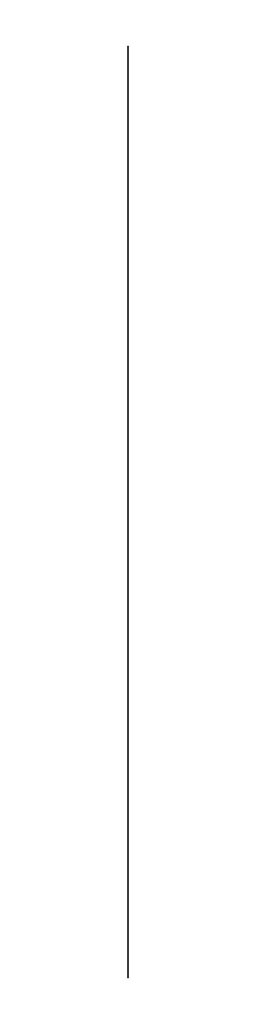
ISO-10303-21;
HEADER;
FILE_DESCRIPTION(('STEP AP214'),'2;1');
FILE_NAME('part.step','',(''),(''),'','','');
FILE_SCHEMA(('AUTOMOTIVE_DESIGN { 1 0 10303 214 1 1 1 1 }'));
ENDSEC;
DATA;
#1=APPLICATION_CONTEXT('core data for automotive mechanical design processes');
#2=APPLICATION_PROTOCOL_DEFINITION('international standard','automotive_design',2000,#1);
#3=PRODUCT_CONTEXT('',#1,'mechanical');
#4=PRODUCT('Part','Part','',(#3));
#5=PRODUCT_RELATED_PRODUCT_CATEGORY('part','',(#4));
#6=PRODUCT_DEFINITION_FORMATION('','',#4);
#7=PRODUCT_DEFINITION_CONTEXT('part definition',#1,'design');
#8=PRODUCT_DEFINITION('design','',#6,#7);
#9=PRODUCT_DEFINITION_SHAPE('','',#8);
#10=(LENGTH_UNIT() NAMED_UNIT(*) SI_UNIT(.MILLI.,.METRE.));
#11=(NAMED_UNIT(*) PLANE_ANGLE_UNIT() SI_UNIT($,.RADIAN.));
#12=(NAMED_UNIT(*) SI_UNIT($,.STERADIAN.) SOLID_ANGLE_UNIT());
#13=UNCERTAINTY_MEASURE_WITH_UNIT(LENGTH_MEASURE(1.E-05),#10,'distance_accuracy_value','');
#14=(GEOMETRIC_REPRESENTATION_CONTEXT(3) GLOBAL_UNCERTAINTY_ASSIGNED_CONTEXT((#13)) GLOBAL_UNIT_ASSIGNED_CONTEXT((#10,
#11,#12)) REPRESENTATION_CONTEXT('',''));
#15=CARTESIAN_POINT('',(0.,0.,0.));
#16=DIRECTION('',(0.,0.,1.));
#17=DIRECTION('',(1.,0.,0.));
#18=AXIS2_PLACEMENT_3D('',#15,#16,#17);
#19=CARTESIAN_POINT('',(0.,200.,0.));
#20=DIRECTION('',(0.,-1.,0.));
#21=DIRECTION('',(0.,0.,-1.));
#22=AXIS2_PLACEMENT_3D('',#19,#20,#21);
#23=CYLINDRICAL_SURFACE('',#22,0.05);
#24=CARTESIAN_POINT('',(0.,200.,0.));
#25=DIRECTION('',(0.,1.,0.));
#26=DIRECTION('',(0.,0.,1.));
#27=AXIS2_PLACEMENT_3D('',#24,#25,#26);
#28=CIRCLE('',#27,0.05);
#29=CARTESIAN_POINT('',(0.,200.,0.05));
#30=VERTEX_POINT('',#29);
#31=EDGE_CURVE('E10',#30,#30,#28,.T.);
#32=ORIENTED_EDGE('',*,*,#31,.F.);
#33=EDGE_LOOP('',(#32));
#34=FACE_BOUND('',#33,.T.);
#35=CARTESIAN_POINT('',(0.,0.,0.));
#36=DIRECTION('',(0.,1.,0.));
#37=DIRECTION('',(0.,0.,1.));
#38=AXIS2_PLACEMENT_3D('',#35,#36,#37);
#39=CIRCLE('',#38,0.05);
#40=CARTESIAN_POINT('',(0.,0.,0.05));
#41=VERTEX_POINT('',#40);
#42=EDGE_CURVE('E38',#41,#41,#39,.T.);
#43=ORIENTED_EDGE('',*,*,#42,.T.);
#44=EDGE_LOOP('',(#43));
#45=FACE_BOUND('',#44,.T.);
#46=ADVANCED_FACE('F35',(#34,#45),#23,.T.);
#47=CARTESIAN_POINT('',(0.,200.,0.));
#48=DIRECTION('',(0.,1.,0.));
#49=DIRECTION('',(0.,0.,1.));
#50=AXIS2_PLACEMENT_3D('',#47,#48,#49);
#51=PLANE('',#50);
#52=ORIENTED_EDGE('',*,*,#31,.T.);
#53=EDGE_LOOP('',(#52));
#54=FACE_BOUND('',#53,.T.);
#55=ADVANCED_FACE('F50',(#54),#51,.T.);
#56=CARTESIAN_POINT('',(0.,0.,0.));
#57=DIRECTION('',(0.,1.,0.));
#58=DIRECTION('',(0.,0.,1.));
#59=AXIS2_PLACEMENT_3D('',#56,#57,#58);
#60=PLANE('',#59);
#61=ORIENTED_EDGE('',*,*,#42,.F.);
#62=EDGE_LOOP('',(#61));
#63=FACE_BOUND('',#62,.T.);
#64=ADVANCED_FACE('F48',(#63),#60,.F.);
#65=CLOSED_SHELL('',(#46,#55,#64));
#66=MANIFOLD_SOLID_BREP('B2',#65);
#67=ADVANCED_BREP_SHAPE_REPRESENTATION('',(#18,#66),#14);
#68=SHAPE_DEFINITION_REPRESENTATION(#9,#67);
ENDSEC;
END-ISO-10303-21;
